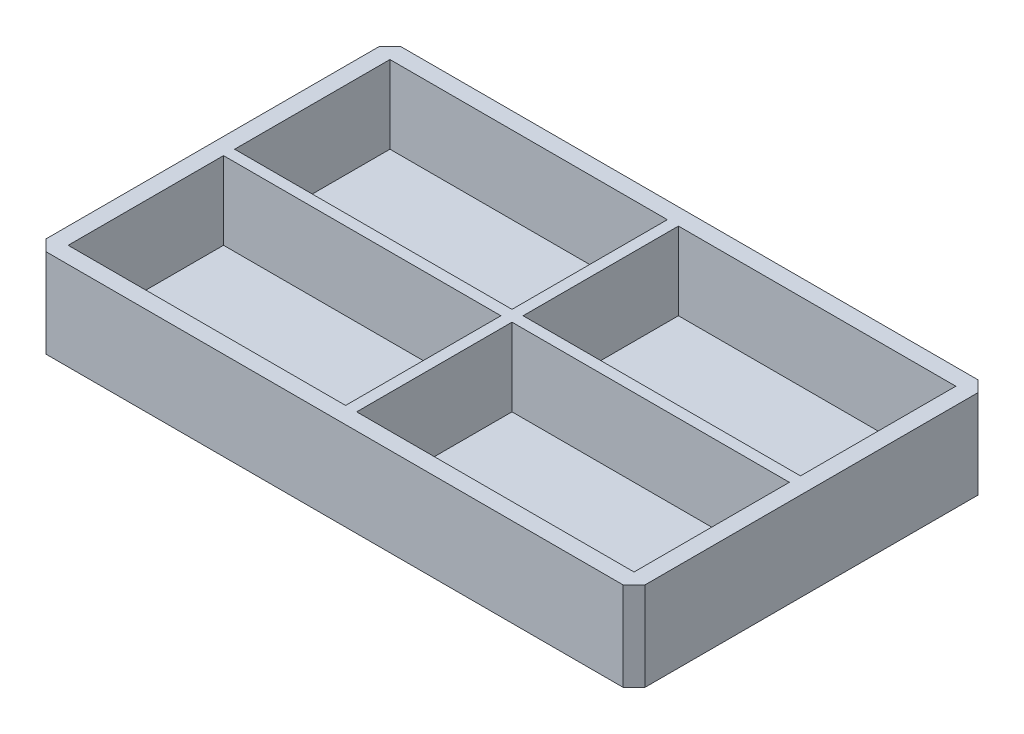
ISO-10303-21;
HEADER;
FILE_DESCRIPTION(('STEP AP214'),'2;1');
FILE_NAME('part.step','',(''),(''),'','','');
FILE_SCHEMA(('AUTOMOTIVE_DESIGN { 1 0 10303 214 1 1 1 1 }'));
ENDSEC;
DATA;
#1=APPLICATION_CONTEXT('core data for automotive mechanical design processes');
#2=APPLICATION_PROTOCOL_DEFINITION('international standard','automotive_design',2000,#1);
#3=PRODUCT_CONTEXT('',#1,'mechanical');
#4=PRODUCT('Part','Part','',(#3));
#5=PRODUCT_RELATED_PRODUCT_CATEGORY('part','',(#4));
#6=PRODUCT_DEFINITION_FORMATION('','',#4);
#7=PRODUCT_DEFINITION_CONTEXT('part definition',#1,'design');
#8=PRODUCT_DEFINITION('design','',#6,#7);
#9=PRODUCT_DEFINITION_SHAPE('','',#8);
#10=(LENGTH_UNIT() NAMED_UNIT(*) SI_UNIT(.MILLI.,.METRE.));
#11=(NAMED_UNIT(*) PLANE_ANGLE_UNIT() SI_UNIT($,.RADIAN.));
#12=(NAMED_UNIT(*) SI_UNIT($,.STERADIAN.) SOLID_ANGLE_UNIT());
#13=UNCERTAINTY_MEASURE_WITH_UNIT(LENGTH_MEASURE(1.E-05),#10,'distance_accuracy_value','');
#14=(GEOMETRIC_REPRESENTATION_CONTEXT(3) GLOBAL_UNCERTAINTY_ASSIGNED_CONTEXT((#13)) GLOBAL_UNIT_ASSIGNED_CONTEXT((#10,
#11,#12)) REPRESENTATION_CONTEXT('',''));
#15=CARTESIAN_POINT('',(0.,0.,0.));
#16=DIRECTION('',(0.,0.,1.));
#17=DIRECTION('',(1.,0.,0.));
#18=AXIS2_PLACEMENT_3D('',#15,#16,#17);
#19=CARTESIAN_POINT('',(0.,7.,0.));
#20=DIRECTION('',(0.,1.,0.));
#21=DIRECTION('',(0.,0.,1.));
#22=AXIS2_PLACEMENT_3D('',#19,#20,#21);
#23=PLANE('',#22);
#24=DIRECTION('',(-1.,0.,0.));
#25=VECTOR('',#24,1.);
#26=CARTESIAN_POINT('',(-25.6956521739131,7.,-15.6404664730699));
#27=LINE('',#26,#25);
#28=CARTESIAN_POINT('',(27.3043478260869,7.,-15.6404664730699));
#29=VERTEX_POINT('',#28);
#30=CARTESIAN_POINT('',(-24.6956521739131,7.,-15.6404664730699));
#31=VERTEX_POINT('',#30);
#32=EDGE_CURVE('E328',#29,#31,#27,.T.);
#33=ORIENTED_EDGE('',*,*,#32,.T.);
#34=DIRECTION('',(0.70710678118655,0.,-0.707106781186545));
#35=VECTOR('',#34,1.);
#36=CARTESIAN_POINT('',(-20.1680593234914,7.,-20.1680593234915));
#37=LINE('',#36,#35);
#38=CARTESIAN_POINT('',(-25.6956521739131,7.,-14.6404664730699));
#39=VERTEX_POINT('',#38);
#40=EDGE_CURVE('E354',#31,#39,#37,.F.);
#41=ORIENTED_EDGE('',*,*,#40,.T.);
#42=DIRECTION('',(0.,0.,1.));
#43=VECTOR('',#42,1.);
#44=CARTESIAN_POINT('',(-25.6956521739131,7.,-15.6404664730699));
#45=LINE('',#44,#43);
#46=CARTESIAN_POINT('',(-25.6956521739131,7.,15.3595335269302));
#47=VERTEX_POINT('',#46);
#48=EDGE_CURVE('E321',#39,#47,#45,.T.);
#49=ORIENTED_EDGE('',*,*,#48,.T.);
#50=DIRECTION('',(-0.707106781186548,0.,-0.707106781186548));
#51=VECTOR('',#50,1.);
#52=CARTESIAN_POINT('',(-20.5275928504216,7.,20.5275928504216));
#53=LINE('',#52,#51);
#54=CARTESIAN_POINT('',(-24.6956521739131,7.,16.3595335269301));
#55=VERTEX_POINT('',#54);
#56=EDGE_CURVE('E352',#47,#55,#53,.F.);
#57=ORIENTED_EDGE('',*,*,#56,.T.);
#58=DIRECTION('',(1.,0.,0.));
#59=VECTOR('',#58,1.);
#60=CARTESIAN_POINT('',(-25.6956521739131,7.,16.3595335269301));
#61=LINE('',#60,#59);
#62=CARTESIAN_POINT('',(27.304347826087,7.,16.3595335269301));
#63=VERTEX_POINT('',#62);
#64=EDGE_CURVE('E324',#55,#63,#61,.T.);
#65=ORIENTED_EDGE('',*,*,#64,.T.);
#66=DIRECTION('',(-0.70710678118655,0.,0.707106781186545));
#67=VECTOR('',#66,1.);
#68=CARTESIAN_POINT('',(21.8319406765085,7.,21.8319406765086));
#69=LINE('',#68,#67);
#70=CARTESIAN_POINT('',(28.304347826087,7.,15.3595335269301));
#71=VERTEX_POINT('',#70);
#72=EDGE_CURVE('E53',#63,#71,#69,.F.);
#73=ORIENTED_EDGE('',*,*,#72,.T.);
#74=DIRECTION('',(0.,0.,-1.));
#75=VECTOR('',#74,1.);
#76=CARTESIAN_POINT('',(28.3043478260869,7.,-15.6404664730699));
#77=LINE('',#76,#75);
#78=CARTESIAN_POINT('',(28.3043478260869,7.,-14.6404664730699));
#79=VERTEX_POINT('',#78);
#80=EDGE_CURVE('E326',#71,#79,#77,.T.);
#81=ORIENTED_EDGE('',*,*,#80,.T.);
#82=DIRECTION('',(0.707106781186548,0.,0.707106781186548));
#83=VECTOR('',#82,1.);
#84=CARTESIAN_POINT('',(21.4724071495784,7.,-21.4724071495784));
#85=LINE('',#84,#83);
#86=EDGE_CURVE('E350',#79,#29,#85,.F.);
#87=ORIENTED_EDGE('',*,*,#86,.T.);
#88=EDGE_LOOP('',(#33,#41,#49,#57,#65,#73,#81,#87));
#89=FACE_BOUND('',#88,.T.);
#90=DIRECTION('',(1.,0.,0.));
#91=VECTOR('',#90,1.);
#92=CARTESIAN_POINT('',(-24.1956521739131,7.,-0.140466473069862));
#93=LINE('',#92,#91);
#94=CARTESIAN_POINT('',(-24.1956521739131,7.,-0.140466473069862));
#95=VERTEX_POINT('',#94);
#96=CARTESIAN_POINT('',(0.804347826086935,7.,-0.140466473069862));
#97=VERTEX_POINT('',#96);
#98=EDGE_CURVE('E294',#95,#97,#93,.T.);
#99=ORIENTED_EDGE('',*,*,#98,.F.);
#100=DIRECTION('',(0.,0.,1.));
#101=VECTOR('',#100,1.);
#102=CARTESIAN_POINT('',(-24.1956521739131,7.,-14.1404664730699));
#103=LINE('',#102,#101);
#104=CARTESIAN_POINT('',(-24.1956521739131,7.,-14.1404664730699));
#105=VERTEX_POINT('',#104);
#106=EDGE_CURVE('E292',#105,#95,#103,.T.);
#107=ORIENTED_EDGE('',*,*,#106,.F.);
#108=DIRECTION('',(-1.,0.,0.));
#109=VECTOR('',#108,1.);
#110=CARTESIAN_POINT('',(-24.1956521739131,7.,-14.1404664730699));
#111=LINE('',#110,#109);
#112=CARTESIAN_POINT('',(0.804347826086935,7.,-14.1404664730699));
#113=VERTEX_POINT('',#112);
#114=EDGE_CURVE('E300',#113,#105,#111,.T.);
#115=ORIENTED_EDGE('',*,*,#114,.F.);
#116=DIRECTION('',(0.,0.,-1.));
#117=VECTOR('',#116,1.);
#118=CARTESIAN_POINT('',(0.804347826086935,7.,-14.1404664730699));
#119=LINE('',#118,#117);
#120=EDGE_CURVE('E297',#97,#113,#119,.T.);
#121=ORIENTED_EDGE('',*,*,#120,.F.);
#122=EDGE_LOOP('',(#99,#107,#115,#121));
#123=FACE_BOUND('',#122,.T.);
#124=DIRECTION('',(1.,0.,0.));
#125=VECTOR('',#124,1.);
#126=CARTESIAN_POINT('',(-24.1956521739131,7.,14.8595335269301));
#127=LINE('',#126,#125);
#128=CARTESIAN_POINT('',(-24.1956521739131,7.,14.8595335269301));
#129=VERTEX_POINT('',#128);
#130=CARTESIAN_POINT('',(0.804347826086939,7.,14.8595335269301));
#131=VERTEX_POINT('',#130);
#132=EDGE_CURVE('E264',#129,#131,#127,.T.);
#133=ORIENTED_EDGE('',*,*,#132,.F.);
#134=DIRECTION('',(0.,0.,1.));
#135=VECTOR('',#134,1.);
#136=CARTESIAN_POINT('',(-24.1956521739131,7.,0.859533526930138));
#137=LINE('',#136,#135);
#138=CARTESIAN_POINT('',(-24.1956521739131,7.,0.859533526930138));
#139=VERTEX_POINT('',#138);
#140=EDGE_CURVE('E262',#139,#129,#137,.T.);
#141=ORIENTED_EDGE('',*,*,#140,.F.);
#142=DIRECTION('',(-1.,0.,0.));
#143=VECTOR('',#142,1.);
#144=CARTESIAN_POINT('',(-24.1956521739131,7.,0.859533526930138));
#145=LINE('',#144,#143);
#146=CARTESIAN_POINT('',(0.804347826086939,7.,0.859533526930138));
#147=VERTEX_POINT('',#146);
#148=EDGE_CURVE('E270',#147,#139,#145,.T.);
#149=ORIENTED_EDGE('',*,*,#148,.F.);
#150=DIRECTION('',(0.,0.,-1.));
#151=VECTOR('',#150,1.);
#152=CARTESIAN_POINT('',(0.804347826086939,7.,0.859533526930138));
#153=LINE('',#152,#151);
#154=EDGE_CURVE('E267',#131,#147,#153,.T.);
#155=ORIENTED_EDGE('',*,*,#154,.F.);
#156=EDGE_LOOP('',(#133,#141,#149,#155));
#157=FACE_BOUND('',#156,.T.);
#158=DIRECTION('',(1.,0.,0.));
#159=VECTOR('',#158,1.);
#160=CARTESIAN_POINT('',(1.80434782608694,7.,-0.140466473069862));
#161=LINE('',#160,#159);
#162=CARTESIAN_POINT('',(1.80434782608694,7.,-0.140466473069862));
#163=VERTEX_POINT('',#162);
#164=CARTESIAN_POINT('',(26.8043478260869,7.,-0.140466473069862));
#165=VERTEX_POINT('',#164);
#166=EDGE_CURVE('E234',#163,#165,#161,.T.);
#167=ORIENTED_EDGE('',*,*,#166,.F.);
#168=DIRECTION('',(0.,0.,1.));
#169=VECTOR('',#168,1.);
#170=CARTESIAN_POINT('',(1.80434782608694,7.,-14.1404664730699));
#171=LINE('',#170,#169);
#172=CARTESIAN_POINT('',(1.80434782608694,7.,-14.1404664730699));
#173=VERTEX_POINT('',#172);
#174=EDGE_CURVE('E232',#173,#163,#171,.T.);
#175=ORIENTED_EDGE('',*,*,#174,.F.);
#176=DIRECTION('',(-1.,0.,0.));
#177=VECTOR('',#176,1.);
#178=CARTESIAN_POINT('',(1.80434782608694,7.,-14.1404664730699));
#179=LINE('',#178,#177);
#180=CARTESIAN_POINT('',(26.8043478260869,7.,-14.1404664730699));
#181=VERTEX_POINT('',#180);
#182=EDGE_CURVE('E240',#181,#173,#179,.T.);
#183=ORIENTED_EDGE('',*,*,#182,.F.);
#184=DIRECTION('',(0.,0.,-1.));
#185=VECTOR('',#184,1.);
#186=CARTESIAN_POINT('',(26.8043478260869,7.,-14.1404664730699));
#187=LINE('',#186,#185);
#188=EDGE_CURVE('E237',#165,#181,#187,.T.);
#189=ORIENTED_EDGE('',*,*,#188,.F.);
#190=EDGE_LOOP('',(#167,#175,#183,#189));
#191=FACE_BOUND('',#190,.T.);
#192=DIRECTION('',(1.,0.,0.));
#193=VECTOR('',#192,1.);
#194=CARTESIAN_POINT('',(1.80434782608694,7.,14.8595335269301));
#195=LINE('',#194,#193);
#196=CARTESIAN_POINT('',(1.80434782608694,7.,14.8595335269301));
#197=VERTEX_POINT('',#196);
#198=CARTESIAN_POINT('',(26.8043478260869,7.,14.8595335269301));
#199=VERTEX_POINT('',#198);
#200=EDGE_CURVE('E222',#197,#199,#195,.T.);
#201=ORIENTED_EDGE('',*,*,#200,.F.);
#202=DIRECTION('',(0.,0.,1.));
#203=VECTOR('',#202,1.);
#204=CARTESIAN_POINT('',(1.80434782608694,7.,0.859533526930138));
#205=LINE('',#204,#203);
#206=CARTESIAN_POINT('',(1.80434782608694,7.,0.859533526930138));
#207=VERTEX_POINT('',#206);
#208=EDGE_CURVE('E220',#207,#197,#205,.T.);
#209=ORIENTED_EDGE('',*,*,#208,.F.);
#210=DIRECTION('',(-1.,0.,0.));
#211=VECTOR('',#210,1.);
#212=CARTESIAN_POINT('',(1.80434782608694,7.,0.859533526930138));
#213=LINE('',#212,#211);
#214=CARTESIAN_POINT('',(26.8043478260869,7.,0.859533526930138));
#215=VERTEX_POINT('',#214);
#216=EDGE_CURVE('E201',#215,#207,#213,.T.);
#217=ORIENTED_EDGE('',*,*,#216,.F.);
#218=DIRECTION('',(0.,0.,-1.));
#219=VECTOR('',#218,1.);
#220=CARTESIAN_POINT('',(26.8043478260869,7.,0.859533526930138));
#221=LINE('',#220,#219);
#222=EDGE_CURVE('E380',#199,#215,#221,.T.);
#223=ORIENTED_EDGE('',*,*,#222,.F.);
#224=EDGE_LOOP('',(#201,#209,#217,#223));
#225=FACE_BOUND('',#224,.T.);
#226=ADVANCED_FACE('F33',(#89,#123,#157,#191,#225),#23,.T.);
#227=CARTESIAN_POINT('',(-25.6956521739131,7.,-15.6404664730699));
#228=DIRECTION('',(1.,0.,0.));
#229=DIRECTION('',(0.,0.,-1.));
#230=AXIS2_PLACEMENT_3D('',#227,#228,#229);
#231=PLANE('',#230);
#232=ORIENTED_EDGE('',*,*,#48,.F.);
#233=DIRECTION('',(0.,-1.,0.));
#234=VECTOR('',#233,1.);
#235=CARTESIAN_POINT('',(-25.6956521739131,7.,-14.6404664730699));
#236=LINE('',#235,#234);
#237=CARTESIAN_POINT('',(-25.6956521739131,-1.,-14.6404664730699));
#238=VERTEX_POINT('',#237);
#239=EDGE_CURVE('E333',#39,#238,#236,.T.);
#240=ORIENTED_EDGE('',*,*,#239,.T.);
#241=DIRECTION('',(0.,0.,-1.));
#242=VECTOR('',#241,1.);
#243=CARTESIAN_POINT('',(-25.6956521739131,-1.,16.3595335269301));
#244=LINE('',#243,#242);
#245=CARTESIAN_POINT('',(-25.6956521739131,-1.,15.3595335269302));
#246=VERTEX_POINT('',#245);
#247=EDGE_CURVE('E375',#246,#238,#244,.T.);
#248=ORIENTED_EDGE('',*,*,#247,.F.);
#249=DIRECTION('',(0.,1.,0.));
#250=VECTOR('',#249,1.);
#251=CARTESIAN_POINT('',(-25.6956521739131,7.,15.3595335269302));
#252=LINE('',#251,#250);
#253=EDGE_CURVE('E331',#246,#47,#252,.T.);
#254=ORIENTED_EDGE('',*,*,#253,.T.);
#255=EDGE_LOOP('',(#232,#240,#248,#254));
#256=FACE_BOUND('',#255,.T.);
#257=ADVANCED_FACE('F392',(#256),#231,.F.);
#258=CARTESIAN_POINT('',(-25.6956521739131,7.,16.3595335269301));
#259=DIRECTION('',(0.,0.,-1.));
#260=DIRECTION('',(-1.,0.,0.));
#261=AXIS2_PLACEMENT_3D('',#258,#259,#260);
#262=PLANE('',#261);
#263=ORIENTED_EDGE('',*,*,#64,.F.);
#264=DIRECTION('',(0.,-1.,0.));
#265=VECTOR('',#264,1.);
#266=CARTESIAN_POINT('',(-24.6956521739131,7.,16.3595335269301));
#267=LINE('',#266,#265);
#268=CARTESIAN_POINT('',(-24.6956521739131,-1.,16.3595335269301));
#269=VERTEX_POINT('',#268);
#270=EDGE_CURVE('E358',#55,#269,#267,.T.);
#271=ORIENTED_EDGE('',*,*,#270,.T.);
#272=DIRECTION('',(-1.,0.,0.));
#273=VECTOR('',#272,1.);
#274=CARTESIAN_POINT('',(-25.6956521739131,-1.,16.3595335269301));
#275=LINE('',#274,#273);
#276=CARTESIAN_POINT('',(27.304347826087,-1.,16.3595335269301));
#277=VERTEX_POINT('',#276);
#278=EDGE_CURVE('E215',#277,#269,#275,.T.);
#279=ORIENTED_EDGE('',*,*,#278,.F.);
#280=DIRECTION('',(0.,1.,0.));
#281=VECTOR('',#280,1.);
#282=CARTESIAN_POINT('',(27.304347826087,7.,16.3595335269301));
#283=LINE('',#282,#281);
#284=EDGE_CURVE('E356',#277,#63,#283,.T.);
#285=ORIENTED_EDGE('',*,*,#284,.T.);
#286=EDGE_LOOP('',(#263,#271,#279,#285));
#287=FACE_BOUND('',#286,.T.);
#288=ADVANCED_FACE('F397',(#287),#262,.F.);
#289=CARTESIAN_POINT('',(28.3043478260869,7.,-15.6404664730699));
#290=DIRECTION('',(-1.,0.,0.));
#291=DIRECTION('',(0.,0.,1.));
#292=AXIS2_PLACEMENT_3D('',#289,#290,#291);
#293=PLANE('',#292);
#294=DIRECTION('',(0.,0.,1.));
#295=VECTOR('',#294,1.);
#296=CARTESIAN_POINT('',(28.3043478260869,-1.,16.3595335269301));
#297=LINE('',#296,#295);
#298=CARTESIAN_POINT('',(28.3043478260869,-1.,-14.6404664730699));
#299=VERTEX_POINT('',#298);
#300=CARTESIAN_POINT('',(28.3043478260869,-1.,15.3595335269301));
#301=VERTEX_POINT('',#300);
#302=EDGE_CURVE('E364',#299,#301,#297,.T.);
#303=ORIENTED_EDGE('',*,*,#302,.F.);
#304=DIRECTION('',(0.,1.,0.));
#305=VECTOR('',#304,1.);
#306=CARTESIAN_POINT('',(28.3043478260869,7.,-14.6404664730699));
#307=LINE('',#306,#305);
#308=EDGE_CURVE('E11',#299,#79,#307,.T.);
#309=ORIENTED_EDGE('',*,*,#308,.T.);
#310=ORIENTED_EDGE('',*,*,#80,.F.);
#311=DIRECTION('',(0.,-1.,0.));
#312=VECTOR('',#311,1.);
#313=CARTESIAN_POINT('',(28.304347826087,7.,15.3595335269301));
#314=LINE('',#313,#312);
#315=EDGE_CURVE('E41',#71,#301,#314,.T.);
#316=ORIENTED_EDGE('',*,*,#315,.T.);
#317=EDGE_LOOP('',(#303,#309,#310,#316));
#318=FACE_BOUND('',#317,.T.);
#319=ADVANCED_FACE('F363',(#318),#293,.F.);
#320=CARTESIAN_POINT('',(-25.6956521739131,7.,-15.6404664730699));
#321=DIRECTION('',(0.,0.,1.));
#322=DIRECTION('',(1.,0.,0.));
#323=AXIS2_PLACEMENT_3D('',#320,#321,#322);
#324=PLANE('',#323);
#325=DIRECTION('',(1.,0.,0.));
#326=VECTOR('',#325,1.);
#327=CARTESIAN_POINT('',(-25.6956521739131,-1.,-15.6404664730699));
#328=LINE('',#327,#326);
#329=CARTESIAN_POINT('',(-24.6956521739131,-1.,-15.6404664730699));
#330=VERTEX_POINT('',#329);
#331=CARTESIAN_POINT('',(27.3043478260869,-1.,-15.6404664730699));
#332=VERTEX_POINT('',#331);
#333=EDGE_CURVE('E372',#330,#332,#328,.T.);
#334=ORIENTED_EDGE('',*,*,#333,.F.);
#335=DIRECTION('',(0.,1.,0.));
#336=VECTOR('',#335,1.);
#337=CARTESIAN_POINT('',(-24.6956521739131,7.,-15.6404664730699));
#338=LINE('',#337,#336);
#339=EDGE_CURVE('E347',#330,#31,#338,.T.);
#340=ORIENTED_EDGE('',*,*,#339,.T.);
#341=ORIENTED_EDGE('',*,*,#32,.F.);
#342=DIRECTION('',(0.,-1.,0.));
#343=VECTOR('',#342,1.);
#344=CARTESIAN_POINT('',(27.3043478260869,7.,-15.6404664730699));
#345=LINE('',#344,#343);
#346=EDGE_CURVE('E344',#29,#332,#345,.T.);
#347=ORIENTED_EDGE('',*,*,#346,.T.);
#348=EDGE_LOOP('',(#334,#340,#341,#347));
#349=FACE_BOUND('',#348,.T.);
#350=ADVANCED_FACE('F405',(#349),#324,.F.);
#351=CARTESIAN_POINT('',(-24.1956521739131,7.,-14.1404664730699));
#352=DIRECTION('',(1.,0.,0.));
#353=DIRECTION('',(0.,0.,-1.));
#354=AXIS2_PLACEMENT_3D('',#351,#352,#353);
#355=PLANE('',#354);
#356=DIRECTION('',(0.,0.,1.));
#357=VECTOR('',#356,1.);
#358=CARTESIAN_POINT('',(-24.1956521739131,0.,-14.1404664730699));
#359=LINE('',#358,#357);
#360=CARTESIAN_POINT('',(-24.1956521739131,0.,-14.1404664730699));
#361=VERTEX_POINT('',#360);
#362=CARTESIAN_POINT('',(-24.1956521739131,0.,-0.140466473069862));
#363=VERTEX_POINT('',#362);
#364=EDGE_CURVE('E291',#361,#363,#359,.T.);
#365=ORIENTED_EDGE('',*,*,#364,.F.);
#366=DIRECTION('',(0.,-1.,0.));
#367=VECTOR('',#366,1.);
#368=CARTESIAN_POINT('',(-24.1956521739131,7.,-14.1404664730699));
#369=LINE('',#368,#367);
#370=EDGE_CURVE('E302',#105,#361,#369,.T.);
#371=ORIENTED_EDGE('',*,*,#370,.F.);
#372=ORIENTED_EDGE('',*,*,#106,.T.);
#373=DIRECTION('',(0.,-1.,0.));
#374=VECTOR('',#373,1.);
#375=CARTESIAN_POINT('',(-24.1956521739131,7.,-0.140466473069862));
#376=LINE('',#375,#374);
#377=EDGE_CURVE('E318',#95,#363,#376,.T.);
#378=ORIENTED_EDGE('',*,*,#377,.T.);
#379=EDGE_LOOP('',(#365,#371,#372,#378));
#380=FACE_BOUND('',#379,.T.);
#381=ADVANCED_FACE('F403',(#380),#355,.T.);
#382=CARTESIAN_POINT('',(-24.1956521739131,7.,-0.140466473069862));
#383=DIRECTION('',(0.,0.,-1.));
#384=DIRECTION('',(-1.,0.,0.));
#385=AXIS2_PLACEMENT_3D('',#382,#383,#384);
#386=PLANE('',#385);
#387=DIRECTION('',(1.,0.,0.));
#388=VECTOR('',#387,1.);
#389=CARTESIAN_POINT('',(-24.1956521739131,0.,-0.140466473069862));
#390=LINE('',#389,#388);
#391=CARTESIAN_POINT('',(0.804347826086935,0.,-0.140466473069862));
#392=VERTEX_POINT('',#391);
#393=EDGE_CURVE('E305',#363,#392,#390,.T.);
#394=ORIENTED_EDGE('',*,*,#393,.F.);
#395=ORIENTED_EDGE('',*,*,#377,.F.);
#396=ORIENTED_EDGE('',*,*,#98,.T.);
#397=DIRECTION('',(0.,-1.,0.));
#398=VECTOR('',#397,1.);
#399=CARTESIAN_POINT('',(0.804347826086935,7.,-0.140466473069862));
#400=LINE('',#399,#398);
#401=EDGE_CURVE('E316',#97,#392,#400,.T.);
#402=ORIENTED_EDGE('',*,*,#401,.T.);
#403=EDGE_LOOP('',(#394,#395,#396,#402));
#404=FACE_BOUND('',#403,.T.);
#405=ADVANCED_FACE('F667',(#404),#386,.T.);
#406=CARTESIAN_POINT('',(0.804347826086935,7.,-14.1404664730699));
#407=DIRECTION('',(-1.,0.,0.));
#408=DIRECTION('',(0.,0.,1.));
#409=AXIS2_PLACEMENT_3D('',#406,#407,#408);
#410=PLANE('',#409);
#411=DIRECTION('',(0.,0.,-1.));
#412=VECTOR('',#411,1.);
#413=CARTESIAN_POINT('',(0.804347826086935,0.,-14.1404664730699));
#414=LINE('',#413,#412);
#415=CARTESIAN_POINT('',(0.804347826086935,0.,-14.1404664730699));
#416=VERTEX_POINT('',#415);
#417=EDGE_CURVE('E308',#392,#416,#414,.T.);
#418=ORIENTED_EDGE('',*,*,#417,.F.);
#419=ORIENTED_EDGE('',*,*,#401,.F.);
#420=ORIENTED_EDGE('',*,*,#120,.T.);
#421=DIRECTION('',(0.,-1.,0.));
#422=VECTOR('',#421,1.);
#423=CARTESIAN_POINT('',(0.804347826086935,7.,-14.1404664730699));
#424=LINE('',#423,#422);
#425=EDGE_CURVE('E314',#113,#416,#424,.T.);
#426=ORIENTED_EDGE('',*,*,#425,.T.);
#427=EDGE_LOOP('',(#418,#419,#420,#426));
#428=FACE_BOUND('',#427,.T.);
#429=ADVANCED_FACE('F657',(#428),#410,.T.);
#430=CARTESIAN_POINT('',(-24.1956521739131,7.,-14.1404664730699));
#431=DIRECTION('',(0.,0.,1.));
#432=DIRECTION('',(1.,0.,0.));
#433=AXIS2_PLACEMENT_3D('',#430,#431,#432);
#434=PLANE('',#433);
#435=DIRECTION('',(-1.,0.,0.));
#436=VECTOR('',#435,1.);
#437=CARTESIAN_POINT('',(-24.1956521739131,0.,-14.1404664730699));
#438=LINE('',#437,#436);
#439=EDGE_CURVE('E295',#416,#361,#438,.T.);
#440=ORIENTED_EDGE('',*,*,#439,.F.);
#441=ORIENTED_EDGE('',*,*,#425,.F.);
#442=ORIENTED_EDGE('',*,*,#114,.T.);
#443=ORIENTED_EDGE('',*,*,#370,.T.);
#444=EDGE_LOOP('',(#440,#441,#442,#443));
#445=FACE_BOUND('',#444,.T.);
#446=ADVANCED_FACE('F647',(#445),#434,.T.);
#447=CARTESIAN_POINT('',(-24.1956521739131,7.,0.859533526930138));
#448=DIRECTION('',(1.,0.,0.));
#449=DIRECTION('',(0.,0.,-1.));
#450=AXIS2_PLACEMENT_3D('',#447,#448,#449);
#451=PLANE('',#450);
#452=DIRECTION('',(0.,0.,1.));
#453=VECTOR('',#452,1.);
#454=CARTESIAN_POINT('',(-24.1956521739131,0.,0.859533526930138));
#455=LINE('',#454,#453);
#456=CARTESIAN_POINT('',(-24.1956521739131,0.,0.859533526930138));
#457=VERTEX_POINT('',#456);
#458=CARTESIAN_POINT('',(-24.1956521739131,0.,14.8595335269301));
#459=VERTEX_POINT('',#458);
#460=EDGE_CURVE('E261',#457,#459,#455,.T.);
#461=ORIENTED_EDGE('',*,*,#460,.F.);
#462=DIRECTION('',(0.,-1.,0.));
#463=VECTOR('',#462,1.);
#464=CARTESIAN_POINT('',(-24.1956521739131,7.,0.859533526930138));
#465=LINE('',#464,#463);
#466=EDGE_CURVE('E272',#139,#457,#465,.T.);
#467=ORIENTED_EDGE('',*,*,#466,.F.);
#468=ORIENTED_EDGE('',*,*,#140,.T.);
#469=DIRECTION('',(0.,-1.,0.));
#470=VECTOR('',#469,1.);
#471=CARTESIAN_POINT('',(-24.1956521739131,7.,14.8595335269301));
#472=LINE('',#471,#470);
#473=EDGE_CURVE('E288',#129,#459,#472,.T.);
#474=ORIENTED_EDGE('',*,*,#473,.T.);
#475=EDGE_LOOP('',(#461,#467,#468,#474));
#476=FACE_BOUND('',#475,.T.);
#477=ADVANCED_FACE('F637',(#476),#451,.T.);
#478=CARTESIAN_POINT('',(-24.1956521739131,7.,14.8595335269301));
#479=DIRECTION('',(0.,0.,-1.));
#480=DIRECTION('',(-1.,0.,0.));
#481=AXIS2_PLACEMENT_3D('',#478,#479,#480);
#482=PLANE('',#481);
#483=DIRECTION('',(1.,0.,0.));
#484=VECTOR('',#483,1.);
#485=CARTESIAN_POINT('',(-24.1956521739131,0.,14.8595335269301));
#486=LINE('',#485,#484);
#487=CARTESIAN_POINT('',(0.804347826086939,0.,14.8595335269301));
#488=VERTEX_POINT('',#487);
#489=EDGE_CURVE('E275',#459,#488,#486,.T.);
#490=ORIENTED_EDGE('',*,*,#489,.F.);
#491=ORIENTED_EDGE('',*,*,#473,.F.);
#492=ORIENTED_EDGE('',*,*,#132,.T.);
#493=DIRECTION('',(0.,-1.,0.));
#494=VECTOR('',#493,1.);
#495=CARTESIAN_POINT('',(0.804347826086939,7.,14.8595335269301));
#496=LINE('',#495,#494);
#497=EDGE_CURVE('E286',#131,#488,#496,.T.);
#498=ORIENTED_EDGE('',*,*,#497,.T.);
#499=EDGE_LOOP('',(#490,#491,#492,#498));
#500=FACE_BOUND('',#499,.T.);
#501=ADVANCED_FACE('F627',(#500),#482,.T.);
#502=CARTESIAN_POINT('',(0.804347826086939,7.,0.859533526930138));
#503=DIRECTION('',(-1.,0.,0.));
#504=DIRECTION('',(0.,0.,1.));
#505=AXIS2_PLACEMENT_3D('',#502,#503,#504);
#506=PLANE('',#505);
#507=DIRECTION('',(0.,0.,-1.));
#508=VECTOR('',#507,1.);
#509=CARTESIAN_POINT('',(0.804347826086939,0.,0.859533526930138));
#510=LINE('',#509,#508);
#511=CARTESIAN_POINT('',(0.804347826086939,0.,0.859533526930138));
#512=VERTEX_POINT('',#511);
#513=EDGE_CURVE('E278',#488,#512,#510,.T.);
#514=ORIENTED_EDGE('',*,*,#513,.F.);
#515=ORIENTED_EDGE('',*,*,#497,.F.);
#516=ORIENTED_EDGE('',*,*,#154,.T.);
#517=DIRECTION('',(0.,-1.,0.));
#518=VECTOR('',#517,1.);
#519=CARTESIAN_POINT('',(0.804347826086939,7.,0.859533526930138));
#520=LINE('',#519,#518);
#521=EDGE_CURVE('E284',#147,#512,#520,.T.);
#522=ORIENTED_EDGE('',*,*,#521,.T.);
#523=EDGE_LOOP('',(#514,#515,#516,#522));
#524=FACE_BOUND('',#523,.T.);
#525=ADVANCED_FACE('F617',(#524),#506,.T.);
#526=CARTESIAN_POINT('',(-24.1956521739131,7.,0.859533526930138));
#527=DIRECTION('',(0.,0.,1.));
#528=DIRECTION('',(1.,0.,0.));
#529=AXIS2_PLACEMENT_3D('',#526,#527,#528);
#530=PLANE('',#529);
#531=DIRECTION('',(-1.,0.,0.));
#532=VECTOR('',#531,1.);
#533=CARTESIAN_POINT('',(-24.1956521739131,0.,0.859533526930138));
#534=LINE('',#533,#532);
#535=EDGE_CURVE('E265',#512,#457,#534,.T.);
#536=ORIENTED_EDGE('',*,*,#535,.F.);
#537=ORIENTED_EDGE('',*,*,#521,.F.);
#538=ORIENTED_EDGE('',*,*,#148,.T.);
#539=ORIENTED_EDGE('',*,*,#466,.T.);
#540=EDGE_LOOP('',(#536,#537,#538,#539));
#541=FACE_BOUND('',#540,.T.);
#542=ADVANCED_FACE('F607',(#541),#530,.T.);
#543=CARTESIAN_POINT('',(1.80434782608694,7.,-14.1404664730699));
#544=DIRECTION('',(1.,0.,0.));
#545=DIRECTION('',(0.,0.,-1.));
#546=AXIS2_PLACEMENT_3D('',#543,#544,#545);
#547=PLANE('',#546);
#548=DIRECTION('',(0.,0.,1.));
#549=VECTOR('',#548,1.);
#550=CARTESIAN_POINT('',(1.80434782608694,0.,-14.1404664730699));
#551=LINE('',#550,#549);
#552=CARTESIAN_POINT('',(1.80434782608694,0.,-14.1404664730699));
#553=VERTEX_POINT('',#552);
#554=CARTESIAN_POINT('',(1.80434782608694,0.,-0.140466473069862));
#555=VERTEX_POINT('',#554);
#556=EDGE_CURVE('E231',#553,#555,#551,.T.);
#557=ORIENTED_EDGE('',*,*,#556,.F.);
#558=DIRECTION('',(0.,-1.,0.));
#559=VECTOR('',#558,1.);
#560=CARTESIAN_POINT('',(1.80434782608694,7.,-14.1404664730699));
#561=LINE('',#560,#559);
#562=EDGE_CURVE('E242',#173,#553,#561,.T.);
#563=ORIENTED_EDGE('',*,*,#562,.F.);
#564=ORIENTED_EDGE('',*,*,#174,.T.);
#565=DIRECTION('',(0.,-1.,0.));
#566=VECTOR('',#565,1.);
#567=CARTESIAN_POINT('',(1.80434782608694,7.,-0.140466473069862));
#568=LINE('',#567,#566);
#569=EDGE_CURVE('E258',#163,#555,#568,.T.);
#570=ORIENTED_EDGE('',*,*,#569,.T.);
#571=EDGE_LOOP('',(#557,#563,#564,#570));
#572=FACE_BOUND('',#571,.T.);
#573=ADVANCED_FACE('F597',(#572),#547,.T.);
#574=CARTESIAN_POINT('',(1.80434782608694,7.,-0.140466473069862));
#575=DIRECTION('',(0.,0.,-1.));
#576=DIRECTION('',(-1.,0.,0.));
#577=AXIS2_PLACEMENT_3D('',#574,#575,#576);
#578=PLANE('',#577);
#579=DIRECTION('',(1.,0.,0.));
#580=VECTOR('',#579,1.);
#581=CARTESIAN_POINT('',(1.80434782608694,0.,-0.140466473069862));
#582=LINE('',#581,#580);
#583=CARTESIAN_POINT('',(26.8043478260869,0.,-0.140466473069862));
#584=VERTEX_POINT('',#583);
#585=EDGE_CURVE('E245',#555,#584,#582,.T.);
#586=ORIENTED_EDGE('',*,*,#585,.F.);
#587=ORIENTED_EDGE('',*,*,#569,.F.);
#588=ORIENTED_EDGE('',*,*,#166,.T.);
#589=DIRECTION('',(0.,-1.,0.));
#590=VECTOR('',#589,1.);
#591=CARTESIAN_POINT('',(26.8043478260869,7.,-0.140466473069862));
#592=LINE('',#591,#590);
#593=EDGE_CURVE('E256',#165,#584,#592,.T.);
#594=ORIENTED_EDGE('',*,*,#593,.T.);
#595=EDGE_LOOP('',(#586,#587,#588,#594));
#596=FACE_BOUND('',#595,.T.);
#597=ADVANCED_FACE('F587',(#596),#578,.T.);
#598=CARTESIAN_POINT('',(26.8043478260869,7.,-14.1404664730699));
#599=DIRECTION('',(-1.,0.,0.));
#600=DIRECTION('',(0.,0.,1.));
#601=AXIS2_PLACEMENT_3D('',#598,#599,#600);
#602=PLANE('',#601);
#603=DIRECTION('',(0.,0.,-1.));
#604=VECTOR('',#603,1.);
#605=CARTESIAN_POINT('',(26.8043478260869,0.,-14.1404664730699));
#606=LINE('',#605,#604);
#607=CARTESIAN_POINT('',(26.8043478260869,0.,-14.1404664730699));
#608=VERTEX_POINT('',#607);
#609=EDGE_CURVE('E248',#584,#608,#606,.T.);
#610=ORIENTED_EDGE('',*,*,#609,.F.);
#611=ORIENTED_EDGE('',*,*,#593,.F.);
#612=ORIENTED_EDGE('',*,*,#188,.T.);
#613=DIRECTION('',(0.,-1.,0.));
#614=VECTOR('',#613,1.);
#615=CARTESIAN_POINT('',(26.8043478260869,7.,-14.1404664730699));
#616=LINE('',#615,#614);
#617=EDGE_CURVE('E254',#181,#608,#616,.T.);
#618=ORIENTED_EDGE('',*,*,#617,.T.);
#619=EDGE_LOOP('',(#610,#611,#612,#618));
#620=FACE_BOUND('',#619,.T.);
#621=ADVANCED_FACE('F577',(#620),#602,.T.);
#622=CARTESIAN_POINT('',(1.80434782608694,7.,-14.1404664730699));
#623=DIRECTION('',(0.,0.,1.));
#624=DIRECTION('',(1.,0.,0.));
#625=AXIS2_PLACEMENT_3D('',#622,#623,#624);
#626=PLANE('',#625);
#627=DIRECTION('',(-1.,0.,0.));
#628=VECTOR('',#627,1.);
#629=CARTESIAN_POINT('',(1.80434782608694,0.,-14.1404664730699));
#630=LINE('',#629,#628);
#631=EDGE_CURVE('E235',#608,#553,#630,.T.);
#632=ORIENTED_EDGE('',*,*,#631,.F.);
#633=ORIENTED_EDGE('',*,*,#617,.F.);
#634=ORIENTED_EDGE('',*,*,#182,.T.);
#635=ORIENTED_EDGE('',*,*,#562,.T.);
#636=EDGE_LOOP('',(#632,#633,#634,#635));
#637=FACE_BOUND('',#636,.T.);
#638=ADVANCED_FACE('F568',(#637),#626,.T.);
#639=CARTESIAN_POINT('',(1.80434782608694,7.,0.859533526930138));
#640=DIRECTION('',(1.,0.,0.));
#641=DIRECTION('',(0.,0.,-1.));
#642=AXIS2_PLACEMENT_3D('',#639,#640,#641);
#643=PLANE('',#642);
#644=DIRECTION('',(0.,0.,1.));
#645=VECTOR('',#644,1.);
#646=CARTESIAN_POINT('',(1.80434782608694,0.,0.859533526930138));
#647=LINE('',#646,#645);
#648=CARTESIAN_POINT('',(1.80434782608694,0.,0.859533526930138));
#649=VERTEX_POINT('',#648);
#650=CARTESIAN_POINT('',(1.80434782608694,0.,14.8595335269301));
#651=VERTEX_POINT('',#650);
#652=EDGE_CURVE('E208',#649,#651,#647,.T.);
#653=ORIENTED_EDGE('',*,*,#652,.F.);
#654=DIRECTION('',(0.,-1.,0.));
#655=VECTOR('',#654,1.);
#656=CARTESIAN_POINT('',(1.80434782608694,7.,0.859533526930138));
#657=LINE('',#656,#655);
#658=EDGE_CURVE('E194',#207,#649,#657,.T.);
#659=ORIENTED_EDGE('',*,*,#658,.F.);
#660=ORIENTED_EDGE('',*,*,#208,.T.);
#661=DIRECTION('',(0.,-1.,0.));
#662=VECTOR('',#661,1.);
#663=CARTESIAN_POINT('',(1.80434782608694,7.,14.8595335269301));
#664=LINE('',#663,#662);
#665=EDGE_CURVE('E211',#197,#651,#664,.T.);
#666=ORIENTED_EDGE('',*,*,#665,.T.);
#667=EDGE_LOOP('',(#653,#659,#660,#666));
#668=FACE_BOUND('',#667,.T.);
#669=ADVANCED_FACE('F209',(#668),#643,.T.);
#670=CARTESIAN_POINT('',(1.80434782608694,7.,14.8595335269301));
#671=DIRECTION('',(0.,0.,-1.));
#672=DIRECTION('',(-1.,0.,0.));
#673=AXIS2_PLACEMENT_3D('',#670,#671,#672);
#674=PLANE('',#673);
#675=DIRECTION('',(1.,0.,0.));
#676=VECTOR('',#675,1.);
#677=CARTESIAN_POINT('',(1.80434782608694,0.,14.8595335269301));
#678=LINE('',#677,#676);
#679=CARTESIAN_POINT('',(26.8043478260869,0.,14.8595335269301));
#680=VERTEX_POINT('',#679);
#681=EDGE_CURVE('E214',#651,#680,#678,.T.);
#682=ORIENTED_EDGE('',*,*,#681,.F.);
#683=ORIENTED_EDGE('',*,*,#665,.F.);
#684=ORIENTED_EDGE('',*,*,#200,.T.);
#685=DIRECTION('',(0.,-1.,0.));
#686=VECTOR('',#685,1.);
#687=CARTESIAN_POINT('',(26.8043478260869,7.,14.8595335269301));
#688=LINE('',#687,#686);
#689=EDGE_CURVE('E228',#199,#680,#688,.T.);
#690=ORIENTED_EDGE('',*,*,#689,.T.);
#691=EDGE_LOOP('',(#682,#683,#684,#690));
#692=FACE_BOUND('',#691,.T.);
#693=ADVANCED_FACE('F384',(#692),#674,.T.);
#694=CARTESIAN_POINT('',(26.8043478260869,7.,0.859533526930138));
#695=DIRECTION('',(-1.,0.,0.));
#696=DIRECTION('',(0.,0.,1.));
#697=AXIS2_PLACEMENT_3D('',#694,#695,#696);
#698=PLANE('',#697);
#699=DIRECTION('',(0.,0.,-1.));
#700=VECTOR('',#699,1.);
#701=CARTESIAN_POINT('',(26.8043478260869,0.,0.859533526930138));
#702=LINE('',#701,#700);
#703=CARTESIAN_POINT('',(26.8043478260869,0.,0.859533526930138));
#704=VERTEX_POINT('',#703);
#705=EDGE_CURVE('E219',#680,#704,#702,.T.);
#706=ORIENTED_EDGE('',*,*,#705,.F.);
#707=ORIENTED_EDGE('',*,*,#689,.F.);
#708=ORIENTED_EDGE('',*,*,#222,.T.);
#709=DIRECTION('',(0.,-1.,0.));
#710=VECTOR('',#709,1.);
#711=CARTESIAN_POINT('',(26.8043478260869,7.,0.859533526930138));
#712=LINE('',#711,#710);
#713=EDGE_CURVE('E204',#215,#704,#712,.T.);
#714=ORIENTED_EDGE('',*,*,#713,.T.);
#715=EDGE_LOOP('',(#706,#707,#708,#714));
#716=FACE_BOUND('',#715,.T.);
#717=ADVANCED_FACE('F389',(#716),#698,.T.);
#718=CARTESIAN_POINT('',(1.80434782608694,7.,0.859533526930138));
#719=DIRECTION('',(0.,0.,1.));
#720=DIRECTION('',(1.,0.,0.));
#721=AXIS2_PLACEMENT_3D('',#718,#719,#720);
#722=PLANE('',#721);
#723=DIRECTION('',(-1.,0.,0.));
#724=VECTOR('',#723,1.);
#725=CARTESIAN_POINT('',(1.80434782608694,0.,0.859533526930138));
#726=LINE('',#725,#724);
#727=EDGE_CURVE('E198',#704,#649,#726,.T.);
#728=ORIENTED_EDGE('',*,*,#727,.F.);
#729=ORIENTED_EDGE('',*,*,#713,.F.);
#730=ORIENTED_EDGE('',*,*,#216,.T.);
#731=ORIENTED_EDGE('',*,*,#658,.T.);
#732=EDGE_LOOP('',(#728,#729,#730,#731));
#733=FACE_BOUND('',#732,.T.);
#734=ADVANCED_FACE('F196',(#733),#722,.T.);
#735=CARTESIAN_POINT('',(0.,0.,0.));
#736=DIRECTION('',(0.,-1.,0.));
#737=DIRECTION('',(0.,0.,-1.));
#738=AXIS2_PLACEMENT_3D('',#735,#736,#737);
#739=PLANE('',#738);
#740=ORIENTED_EDGE('',*,*,#652,.T.);
#741=ORIENTED_EDGE('',*,*,#681,.T.);
#742=ORIENTED_EDGE('',*,*,#705,.T.);
#743=ORIENTED_EDGE('',*,*,#727,.T.);
#744=EDGE_LOOP('',(#740,#741,#742,#743));
#745=FACE_BOUND('',#744,.T.);
#746=ADVANCED_FACE('F217',(#745),#739,.F.);
#747=ORIENTED_EDGE('',*,*,#556,.T.);
#748=ORIENTED_EDGE('',*,*,#585,.T.);
#749=ORIENTED_EDGE('',*,*,#609,.T.);
#750=ORIENTED_EDGE('',*,*,#631,.T.);
#751=EDGE_LOOP('',(#747,#748,#749,#750));
#752=FACE_BOUND('',#751,.T.);
#753=ADVANCED_FACE('F522',(#752),#739,.F.);
#754=ORIENTED_EDGE('',*,*,#460,.T.);
#755=ORIENTED_EDGE('',*,*,#489,.T.);
#756=ORIENTED_EDGE('',*,*,#513,.T.);
#757=ORIENTED_EDGE('',*,*,#535,.T.);
#758=EDGE_LOOP('',(#754,#755,#756,#757));
#759=FACE_BOUND('',#758,.T.);
#760=ADVANCED_FACE('F512',(#759),#739,.F.);
#761=ORIENTED_EDGE('',*,*,#364,.T.);
#762=ORIENTED_EDGE('',*,*,#393,.T.);
#763=ORIENTED_EDGE('',*,*,#417,.T.);
#764=ORIENTED_EDGE('',*,*,#439,.T.);
#765=EDGE_LOOP('',(#761,#762,#763,#764));
#766=FACE_BOUND('',#765,.T.);
#767=ADVANCED_FACE('F468',(#766),#739,.F.);
#768=CARTESIAN_POINT('',(0.,-1.,0.));
#769=DIRECTION('',(0.,-1.,0.));
#770=DIRECTION('',(0.,0.,-1.));
#771=AXIS2_PLACEMENT_3D('',#768,#769,#770);
#772=PLANE('',#771);
#773=ORIENTED_EDGE('',*,*,#247,.T.);
#774=DIRECTION('',(-0.70710678118655,0.,0.707106781186545));
#775=VECTOR('',#774,1.);
#776=CARTESIAN_POINT('',(-20.1680593234914,-1.,-20.1680593234915));
#777=LINE('',#776,#775);
#778=EDGE_CURVE('E342',#238,#330,#777,.F.);
#779=ORIENTED_EDGE('',*,*,#778,.T.);
#780=ORIENTED_EDGE('',*,*,#333,.T.);
#781=DIRECTION('',(-0.707106781186548,0.,-0.707106781186548));
#782=VECTOR('',#781,1.);
#783=CARTESIAN_POINT('',(21.4724071495784,-1.,-21.4724071495784));
#784=LINE('',#783,#782);
#785=EDGE_CURVE('E338',#332,#299,#784,.F.);
#786=ORIENTED_EDGE('',*,*,#785,.T.);
#787=ORIENTED_EDGE('',*,*,#302,.T.);
#788=DIRECTION('',(0.70710678118655,0.,-0.707106781186545));
#789=VECTOR('',#788,1.);
#790=CARTESIAN_POINT('',(21.8319406765085,-1.,21.8319406765086));
#791=LINE('',#790,#789);
#792=EDGE_CURVE('E336',#301,#277,#791,.F.);
#793=ORIENTED_EDGE('',*,*,#792,.T.);
#794=ORIENTED_EDGE('',*,*,#278,.T.);
#795=DIRECTION('',(0.707106781186548,0.,0.707106781186548));
#796=VECTOR('',#795,1.);
#797=CARTESIAN_POINT('',(-20.5275928504216,-1.,20.5275928504216));
#798=LINE('',#797,#796);
#799=EDGE_CURVE('E340',#269,#246,#798,.F.);
#800=ORIENTED_EDGE('',*,*,#799,.T.);
#801=EDGE_LOOP('',(#773,#779,#780,#786,#787,#793,#794,#800));
#802=FACE_BOUND('',#801,.T.);
#803=ADVANCED_FACE('F368',(#802),#772,.T.);
#804=CARTESIAN_POINT('',(-25.6956521739131,7.,-14.6404664730699));
#805=DIRECTION('',(0.707106781186545,0.,0.70710678118655));
#806=DIRECTION('',(0.,-1.,0.));
#807=AXIS2_PLACEMENT_3D('',#804,#805,#806);
#808=PLANE('',#807);
#809=ORIENTED_EDGE('',*,*,#40,.F.);
#810=ORIENTED_EDGE('',*,*,#339,.F.);
#811=ORIENTED_EDGE('',*,*,#778,.F.);
#812=ORIENTED_EDGE('',*,*,#239,.F.);
#813=EDGE_LOOP('',(#809,#810,#811,#812));
#814=FACE_BOUND('',#813,.T.);
#815=ADVANCED_FACE('F414',(#814),#808,.F.);
#816=CARTESIAN_POINT('',(-24.6956521739131,7.,16.3595335269301));
#817=DIRECTION('',(0.707106781186547,0.,-0.707106781186547));
#818=DIRECTION('',(0.,-1.,0.));
#819=AXIS2_PLACEMENT_3D('',#816,#817,#818);
#820=PLANE('',#819);
#821=ORIENTED_EDGE('',*,*,#56,.F.);
#822=ORIENTED_EDGE('',*,*,#253,.F.);
#823=ORIENTED_EDGE('',*,*,#799,.F.);
#824=ORIENTED_EDGE('',*,*,#270,.F.);
#825=EDGE_LOOP('',(#821,#822,#823,#824));
#826=FACE_BOUND('',#825,.T.);
#827=ADVANCED_FACE('F417',(#826),#820,.F.);
#828=CARTESIAN_POINT('',(27.3043478260869,7.,-15.6404664730699));
#829=DIRECTION('',(-0.707106781186547,0.,0.707106781186547));
#830=DIRECTION('',(0.,-1.,0.));
#831=AXIS2_PLACEMENT_3D('',#828,#829,#830);
#832=PLANE('',#831);
#833=ORIENTED_EDGE('',*,*,#86,.F.);
#834=ORIENTED_EDGE('',*,*,#308,.F.);
#835=ORIENTED_EDGE('',*,*,#785,.F.);
#836=ORIENTED_EDGE('',*,*,#346,.F.);
#837=EDGE_LOOP('',(#833,#834,#835,#836));
#838=FACE_BOUND('',#837,.T.);
#839=ADVANCED_FACE('F420',(#838),#832,.F.);
#840=CARTESIAN_POINT('',(28.304347826087,7.,15.3595335269301));
#841=DIRECTION('',(-0.707106781186545,0.,-0.70710678118655));
#842=DIRECTION('',(0.,-1.,0.));
#843=AXIS2_PLACEMENT_3D('',#840,#841,#842);
#844=PLANE('',#843);
#845=ORIENTED_EDGE('',*,*,#72,.F.);
#846=ORIENTED_EDGE('',*,*,#284,.F.);
#847=ORIENTED_EDGE('',*,*,#792,.F.);
#848=ORIENTED_EDGE('',*,*,#315,.F.);
#849=EDGE_LOOP('',(#845,#846,#847,#848));
#850=FACE_BOUND('',#849,.T.);
#851=ADVANCED_FACE('F35',(#850),#844,.F.);
#852=CLOSED_SHELL('',(#226,#257,#288,#319,#350,#381,#405,#429,#446,#477,#501,#525,#542,#573,
#597,#621,#638,#669,#693,#717,#734,#746,#753,#760,#767,#803,#815,#827,#839,#851));
#853=MANIFOLD_SOLID_BREP('B2',#852);
#854=ADVANCED_BREP_SHAPE_REPRESENTATION('',(#18,#853),#14);
#855=SHAPE_DEFINITION_REPRESENTATION(#9,#854);
ENDSEC;
END-ISO-10303-21;
